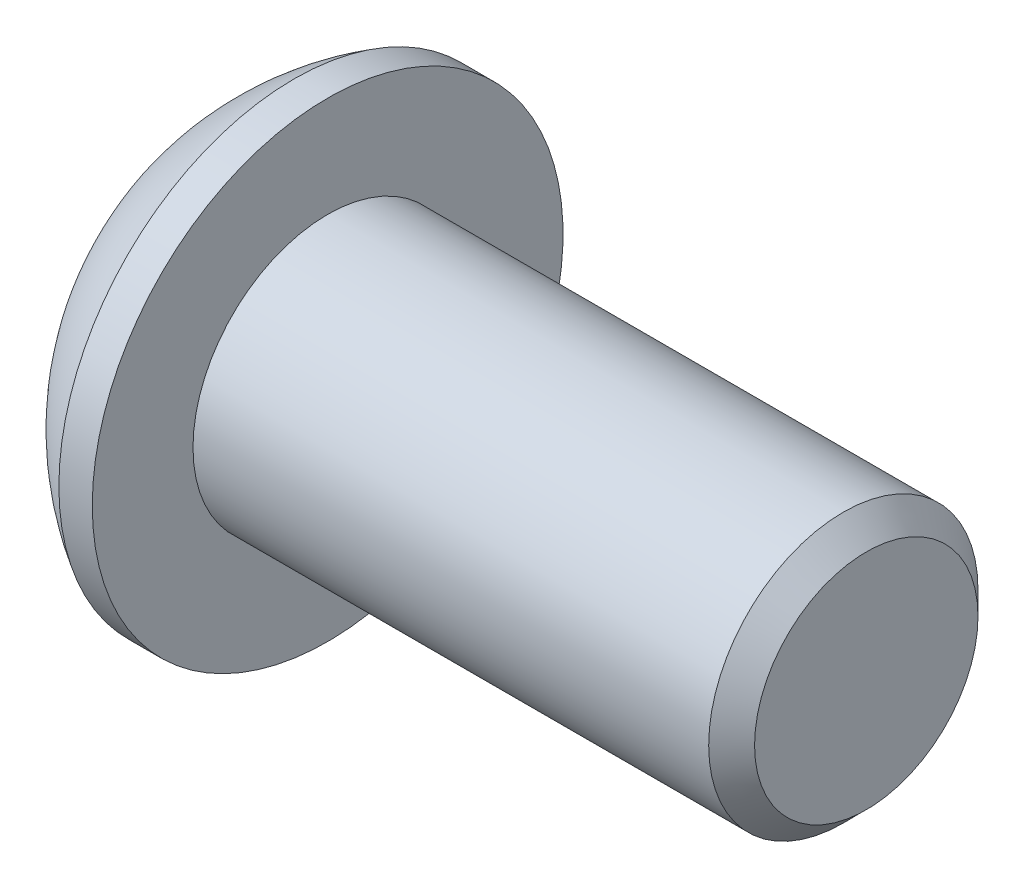
ISO-10303-21;
HEADER;
FILE_DESCRIPTION(('STEP AP214'),'2;1');
FILE_NAME('part.step','',(''),(''),'','','');
FILE_SCHEMA(('AUTOMOTIVE_DESIGN { 1 0 10303 214 1 1 1 1 }'));
ENDSEC;
DATA;
#1=APPLICATION_CONTEXT('core data for automotive mechanical design processes');
#2=APPLICATION_PROTOCOL_DEFINITION('international standard','automotive_design',2000,#1);
#3=PRODUCT_CONTEXT('',#1,'mechanical');
#4=PRODUCT('Part','Part','',(#3));
#5=PRODUCT_RELATED_PRODUCT_CATEGORY('part','',(#4));
#6=PRODUCT_DEFINITION_FORMATION('','',#4);
#7=PRODUCT_DEFINITION_CONTEXT('part definition',#1,'design');
#8=PRODUCT_DEFINITION('design','',#6,#7);
#9=PRODUCT_DEFINITION_SHAPE('','',#8);
#10=(LENGTH_UNIT() NAMED_UNIT(*) SI_UNIT(.MILLI.,.METRE.));
#11=(NAMED_UNIT(*) PLANE_ANGLE_UNIT() SI_UNIT($,.RADIAN.));
#12=(NAMED_UNIT(*) SI_UNIT($,.STERADIAN.) SOLID_ANGLE_UNIT());
#13=UNCERTAINTY_MEASURE_WITH_UNIT(LENGTH_MEASURE(1.E-05),#10,'distance_accuracy_value','');
#14=(GEOMETRIC_REPRESENTATION_CONTEXT(3) GLOBAL_UNCERTAINTY_ASSIGNED_CONTEXT((#13)) GLOBAL_UNIT_ASSIGNED_CONTEXT((#10,
#11,#12)) REPRESENTATION_CONTEXT('',''));
#15=CARTESIAN_POINT('',(0.,0.,0.));
#16=DIRECTION('',(0.,0.,1.));
#17=DIRECTION('',(1.,0.,0.));
#18=AXIS2_PLACEMENT_3D('',#15,#16,#17);
#19=CARTESIAN_POINT('',(0.,0.,0.));
#20=DIRECTION('',(-1.,0.,0.));
#21=DIRECTION('',(0.,0.,1.));
#22=AXIS2_PLACEMENT_3D('',#19,#20,#21);
#23=PLANE('',#22);
#24=CARTESIAN_POINT('',(0.,0.,0.));
#25=DIRECTION('',(-1.,0.,0.));
#26=DIRECTION('',(0.,0.,1.));
#27=AXIS2_PLACEMENT_3D('',#24,#25,#26);
#28=CIRCLE('',#27,2.77495);
#29=CARTESIAN_POINT('',(0.,2.77495,0.));
#30=VERTEX_POINT('',#29);
#31=EDGE_CURVE('E11',#30,#30,#28,.T.);
#32=ORIENTED_EDGE('',*,*,#31,.T.);
#33=EDGE_LOOP('',(#32));
#34=FACE_BOUND('',#33,.T.);
#35=DIRECTION('',(0.,-1.,0.));
#36=VECTOR('',#35,1.);
#37=CARTESIAN_POINT('',(0.,-1.14384635331849,1.9812));
#38=LINE('',#37,#36);
#39=CARTESIAN_POINT('',(0.,1.14384635331849,1.9812));
#40=VERTEX_POINT('',#39);
#41=CARTESIAN_POINT('',(0.,-1.14384635331849,1.9812));
#42=VERTEX_POINT('',#41);
#43=EDGE_CURVE('E46',#40,#42,#38,.T.);
#44=ORIENTED_EDGE('',*,*,#43,.T.);
#45=DIRECTION('',(0.,-0.5,-0.866025403784439));
#46=VECTOR('',#45,1.);
#47=CARTESIAN_POINT('',(0.,-2.28769270663697,0.));
#48=LINE('',#47,#46);
#49=CARTESIAN_POINT('',(0.,-2.28769270663697,0.));
#50=VERTEX_POINT('',#49);
#51=EDGE_CURVE('E362',#42,#50,#48,.T.);
#52=ORIENTED_EDGE('',*,*,#51,.T.);
#53=DIRECTION('',(0.,0.5,-0.866025403784439));
#54=VECTOR('',#53,1.);
#55=CARTESIAN_POINT('',(0.,-1.14384635331849,-1.9812));
#56=LINE('',#55,#54);
#57=CARTESIAN_POINT('',(0.,-1.14384635331849,-1.9812));
#58=VERTEX_POINT('',#57);
#59=EDGE_CURVE('E126',#50,#58,#56,.T.);
#60=ORIENTED_EDGE('',*,*,#59,.T.);
#61=DIRECTION('',(0.,1.,0.));
#62=VECTOR('',#61,1.);
#63=CARTESIAN_POINT('',(0.,1.14384635331849,-1.9812));
#64=LINE('',#63,#62);
#65=CARTESIAN_POINT('',(0.,1.14384635331849,-1.9812));
#66=VERTEX_POINT('',#65);
#67=EDGE_CURVE('E365',#58,#66,#64,.T.);
#68=ORIENTED_EDGE('',*,*,#67,.T.);
#69=DIRECTION('',(0.,0.5,0.866025403784439));
#70=VECTOR('',#69,1.);
#71=CARTESIAN_POINT('',(0.,2.28769270663697,0.));
#72=LINE('',#71,#70);
#73=CARTESIAN_POINT('',(0.,2.28769270663697,0.));
#74=VERTEX_POINT('',#73);
#75=EDGE_CURVE('E367',#66,#74,#72,.T.);
#76=ORIENTED_EDGE('',*,*,#75,.T.);
#77=DIRECTION('',(0.,-0.5,0.866025403784439));
#78=VECTOR('',#77,1.);
#79=CARTESIAN_POINT('',(0.,1.14384635331849,1.9812));
#80=LINE('',#79,#78);
#81=EDGE_CURVE('E369',#74,#40,#80,.T.);
#82=ORIENTED_EDGE('',*,*,#81,.T.);
#83=EDGE_LOOP('',(#44,#52,#60,#68,#76,#82));
#84=FACE_BOUND('',#83,.T.);
#85=ADVANCED_FACE('F32',(#34,#84),#23,.T.);
#86=CARTESIAN_POINT('',(5.78512506188119,0.,0.));
#87=DIRECTION('',(-1.,0.,0.));
#88=DIRECTION('',(0.,1.,0.));
#89=AXIS2_PLACEMENT_3D('',#86,#87,#88);
#90=SPHERICAL_SURFACE('',#89,6.41623094067739);
#91=CARTESIAN_POINT('',(2.5654,0.,0.));
#92=DIRECTION('',(-1.,0.,0.));
#93=DIRECTION('',(0.,0.,1.));
#94=AXIS2_PLACEMENT_3D('',#91,#92,#93);
#95=CIRCLE('',#94,5.5499);
#96=CARTESIAN_POINT('',(2.5654,5.5499,0.));
#97=VERTEX_POINT('',#96);
#98=EDGE_CURVE('E39',#97,#97,#95,.T.);
#99=CARTESIAN_POINT('',(2.5654,5.5499,0.));
#100=CARTESIAN_POINT('',(2.53083708566419,5.52984868712258,0.));
#101=CARTESIAN_POINT('',(2.49646152825914,5.50947442663449,0.));
#102=CARTESIAN_POINT('',(2.42809701945272,5.4680872977392,0.));
#103=CARTESIAN_POINT('',(2.39410806805135,5.447074429332,0.));
#104=CARTESIAN_POINT('',(2.32652866339446,5.40441737190071,0.));
#105=CARTESIAN_POINT('',(2.29293821013895,5.38277318287661,0.));
#106=CARTESIAN_POINT('',(2.22616751866502,5.33886105159856,0.));
#107=CARTESIAN_POINT('',(2.19298728044662,5.3165931093446,0.));
#108=CARTESIAN_POINT('',(2.12704860244366,5.27144124070729,0.));
#109=CARTESIAN_POINT('',(2.09429016265912,5.24855731432393,0.));
#110=CARTESIAN_POINT('',(2.02920651509859,5.20218146582175,0.));
#111=CARTESIAN_POINT('',(1.99688130732261,5.17868954370292,0.));
#112=CARTESIAN_POINT('',(1.93267540683267,5.13110590319174,0.));
#113=CARTESIAN_POINT('',(1.90079471411871,5.10701418479938,0.));
#114=CARTESIAN_POINT('',(1.83748897146475,5.05823936086598,0.));
#115=CARTESIAN_POINT('',(1.80606392152475,5.03355625532495,0.));
#116=CARTESIAN_POINT('',(1.74368043314138,4.98360727255644,0.));
#117=CARTESIAN_POINT('',(1.71272199469802,4.95834139532897,0.));
#118=CARTESIAN_POINT('',(1.65128253514951,4.90723568808467,0.));
#119=CARTESIAN_POINT('',(1.62080151404435,4.88139585806785,0.));
#120=CARTESIAN_POINT('',(1.56032752837792,4.82915126447052,0.));
#121=CARTESIAN_POINT('',(1.53033456381665,4.80274650089003,0.));
#122=CARTESIAN_POINT('',(1.4708471600897,4.74938125657909,0.));
#123=CARTESIAN_POINT('',(1.44135272092403,4.72242077584864,0.));
#124=CARTESIAN_POINT('',(1.38287266283316,4.66795350762059,0.));
#125=CARTESIAN_POINT('',(1.35388704390797,4.64044672012299,0.));
#126=CARTESIAN_POINT('',(1.29643474354244,4.58489643942841,0.));
#127=CARTESIAN_POINT('',(1.26796806210209,4.55685294623144,0.));
#128=CARTESIAN_POINT('',(1.21156357281885,4.50023904253955,0.));
#129=CARTESIAN_POINT('',(1.18362576497595,4.47166863204464,0.));
#130=CARTESIAN_POINT('',(1.12828877440023,4.41401086607543,0.));
#131=CARTESIAN_POINT('',(1.10088959166741,4.38492351060113,0.));
#132=CARTESIAN_POINT('',(1.04663941482087,4.32624200742801,0.));
#133=CARTESIAN_POINT('',(1.01978842070714,4.2966478597292,0.));
#134=CARTESIAN_POINT('',(0.966643993266069,4.2369631017545,0.));
#135=CARTESIAN_POINT('',(0.94035055993872,4.20687249147862,0.));
#136=CARTESIAN_POINT('',(0.888330431624668,4.14620531128432,0.));
#137=CARTESIAN_POINT('',(0.862603736637966,4.11562874136591,0.));
#138=CARTESIAN_POINT('',(0.811726064743087,4.05400031444217,0.));
#139=CARTESIAN_POINT('',(0.786575087834911,4.02294845743684,0.));
#140=CARTESIAN_POINT('',(0.736857630884291,3.96038029479081,0.));
#141=CARTESIAN_POINT('',(0.712291150841848,3.9288639891501,0.));
#142=CARTESIAN_POINT('',(0.6637512623949,3.8653779297977,0.));
#143=CARTESIAN_POINT('',(0.639777853990396,3.833408176086,0.));
#144=CARTESIAN_POINT('',(0.592432476584127,3.76902637942894,0.));
#145=CARTESIAN_POINT('',(0.569060507582362,3.73661433648358,0.));
#146=CARTESIAN_POINT('',(0.522926166816147,3.67135927457555,0.));
#147=CARTESIAN_POINT('',(0.500163795051696,3.63851625561289,0.));
#148=CARTESIAN_POINT('',(0.455256593824864,3.57241070531295,0.));
#149=CARTESIAN_POINT('',(0.433111764362482,3.53914817397566,0.));
#150=CARTESIAN_POINT('',(0.389447377232278,3.47221520900886,0.));
#151=CARTESIAN_POINT('',(0.367927819564456,3.43854477537934,0.));
#152=CARTESIAN_POINT('',(0.325521487354906,3.37080775824281,0.));
#153=CARTESIAN_POINT('',(0.304634712813178,3.3367411747358,0.));
#154=CARTESIAN_POINT('',(0.263501236996927,3.26822374869429,0.));
#155=CARTESIAN_POINT('',(0.243254535722403,3.23377290615979,0.));
#156=CARTESIAN_POINT('',(0.203408274368182,3.16449898643303,0.));
#157=CARTESIAN_POINT('',(0.183808714288484,3.12967590924077,0.));
#158=CARTESIAN_POINT('',(0.14526357289266,3.05966967674634,0.));
#159=CARTESIAN_POINT('',(0.126317991576534,3.02448652144419,0.));
#160=CARTESIAN_POINT('',(0.089087433723099,2.95377240655615,0.));
#161=CARTESIAN_POINT('',(0.0708024571857911,2.91824144697028,0.));
#162=CARTESIAN_POINT('',(0.0348994419493881,2.84684415010637,0.));
#163=CARTESIAN_POINT('',(0.017281403250293,2.81097781282834,0.));
#164=CARTESIAN_POINT('',(0.,2.77495,0.));
#165=B_SPLINE_CURVE_WITH_KNOTS('',3,(#99,#100,#101,#102,#103,#104,#105,#106,#107,#108,#109,#110,
#111,#112,#113,#114,#115,#116,#117,#118,#119,#120,#121,#122,#123,#124,#125,#126,#127,#128,#129,
#130,#131,#132,#133,#134,#135,#136,#137,#138,#139,#140,#141,#142,#143,#144,#145,#146,#147,#148,
#149,#150,#151,#152,#153,#154,#155,#156,#157,#158,#159,#160,#161,#162,#163,#164),.UNSPECIFIED.,
.F.,.F.,(4,2,2,2,2,2,2,2,2,2,2,2,2,2,2,2,2,2,2,2,2,2,2,2,2,2,2,2,2,2,2,2,4),(0.,
0.119872570538484,0.239745141076968,0.359617711615453,0.479490282153937,0.599362852692421,
0.719235423230905,0.83910799376939,0.958980564307873,1.07885313484636,1.19872570538484,
1.31859827592333,1.43847084646181,1.55834341700029,1.67821598753878,1.79808855807726,
1.91796112861575,2.03783369915423,2.15770626969271,2.2775788402312,2.39745141076968,
2.51732398130817,2.63719655184665,2.75706912238513,2.87694169292362,2.9968142634621,
3.11668683400059,3.23655940453907,3.35643197507756,3.47630454561604,3.59617711615452,
3.71604968669301,3.83592225723149),.UNSPECIFIED.);
#166=EDGE_CURVE('BSEAM153',#97,#30,#165,.T.);
#167=ORIENTED_EDGE('',*,*,#98,.T.);
#168=ORIENTED_EDGE('',*,*,#31,.F.);
#169=ORIENTED_EDGE('',*,*,#166,.T.);
#170=ORIENTED_EDGE('',*,*,#166,.F.);
#171=EDGE_LOOP('',(#167,#169,#168,#170));
#172=FACE_BOUND('',#171,.T.);
#173=ADVANCED_FACE('F153',(#172),#90,.T.);
#174=CARTESIAN_POINT('',(0.,0.,0.));
#175=DIRECTION('',(-1.,0.,0.));
#176=DIRECTION('',(0.,0.,1.));
#177=AXIS2_PLACEMENT_3D('',#174,#175,#176);
#178=CYLINDRICAL_SURFACE('',#177,5.5499);
#179=ORIENTED_EDGE('',*,*,#98,.F.);
#180=EDGE_LOOP('',(#179));
#181=FACE_BOUND('',#180,.T.);
#182=CARTESIAN_POINT('',(3.3528,0.,0.));
#183=DIRECTION('',(-1.,0.,0.));
#184=DIRECTION('',(0.,0.,1.));
#185=AXIS2_PLACEMENT_3D('',#182,#183,#184);
#186=CIRCLE('',#185,5.5499);
#187=CARTESIAN_POINT('',(3.3528,0.,5.5499));
#188=VERTEX_POINT('',#187);
#189=EDGE_CURVE('E148',#188,#188,#186,.T.);
#190=ORIENTED_EDGE('',*,*,#189,.T.);
#191=EDGE_LOOP('',(#190));
#192=FACE_BOUND('',#191,.T.);
#193=ADVANCED_FACE('F156',(#181,#192),#178,.T.);
#194=CARTESIAN_POINT('',(3.3528,3.17499999999999,0.));
#195=DIRECTION('',(-1.,0.,0.));
#196=DIRECTION('',(0.,0.,1.));
#197=AXIS2_PLACEMENT_3D('',#194,#195,#196);
#198=PLANE('',#197);
#199=ORIENTED_EDGE('',*,*,#189,.F.);
#200=EDGE_LOOP('',(#199));
#201=FACE_BOUND('',#200,.T.);
#202=CARTESIAN_POINT('',(3.3528,0.,0.));
#203=DIRECTION('',(-1.,0.,0.));
#204=DIRECTION('',(0.,0.,1.));
#205=AXIS2_PLACEMENT_3D('',#202,#203,#204);
#206=CIRCLE('',#205,3.17499999999999);
#207=CARTESIAN_POINT('',(3.3528,0.,3.17499999999999));
#208=VERTEX_POINT('',#207);
#209=EDGE_CURVE('E145',#208,#208,#206,.T.);
#210=ORIENTED_EDGE('',*,*,#209,.T.);
#211=EDGE_LOOP('',(#210));
#212=FACE_BOUND('',#211,.T.);
#213=ADVANCED_FACE('F159',(#201,#212),#198,.F.);
#214=CARTESIAN_POINT('',(0.,0.,0.));
#215=DIRECTION('',(-1.,0.,0.));
#216=DIRECTION('',(0.,0.,1.));
#217=AXIS2_PLACEMENT_3D('',#214,#215,#216);
#218=CYLINDRICAL_SURFACE('',#217,3.17499999999999);
#219=ORIENTED_EDGE('',*,*,#209,.F.);
#220=EDGE_LOOP('',(#219));
#221=FACE_BOUND('',#220,.T.);
#222=CARTESIAN_POINT('',(15.51178,0.,0.));
#223=DIRECTION('',(-1.,0.,0.));
#224=DIRECTION('',(0.,0.,1.));
#225=AXIS2_PLACEMENT_3D('',#222,#223,#224);
#226=CIRCLE('',#225,3.17499999999999);
#227=CARTESIAN_POINT('',(15.51178,0.,3.17499999999999));
#228=VERTEX_POINT('',#227);
#229=EDGE_CURVE('E142',#228,#228,#226,.T.);
#230=ORIENTED_EDGE('',*,*,#229,.T.);
#231=EDGE_LOOP('',(#230));
#232=FACE_BOUND('',#231,.T.);
#233=ADVANCED_FACE('F165',(#221,#232),#218,.T.);
#234=CARTESIAN_POINT('',(16.0528,0.,0.));
#235=DIRECTION('',(-1.,0.,0.));
#236=DIRECTION('',(0.,0.,1.));
#237=AXIS2_PLACEMENT_3D('',#234,#235,#236);
#238=CONICAL_SURFACE('',#237,2.63398,0.785398163397462);
#239=ORIENTED_EDGE('',*,*,#229,.F.);
#240=EDGE_LOOP('',(#239));
#241=FACE_BOUND('',#240,.T.);
#242=CARTESIAN_POINT('',(16.0528,0.,0.));
#243=DIRECTION('',(-1.,0.,0.));
#244=DIRECTION('',(0.,0.,1.));
#245=AXIS2_PLACEMENT_3D('',#242,#243,#244);
#246=CIRCLE('',#245,2.63398);
#247=CARTESIAN_POINT('',(16.0528,0.,2.63398));
#248=VERTEX_POINT('',#247);
#249=EDGE_CURVE('E138',#248,#248,#246,.T.);
#250=ORIENTED_EDGE('',*,*,#249,.T.);
#251=EDGE_LOOP('',(#250));
#252=FACE_BOUND('',#251,.T.);
#253=ADVANCED_FACE('F171',(#241,#252),#238,.T.);
#254=CARTESIAN_POINT('',(16.0528,0.,0.));
#255=DIRECTION('',(-1.,0.,0.));
#256=DIRECTION('',(0.,0.,1.));
#257=AXIS2_PLACEMENT_3D('',#254,#255,#256);
#258=PLANE('',#257);
#259=ORIENTED_EDGE('',*,*,#249,.F.);
#260=EDGE_LOOP('',(#259));
#261=FACE_BOUND('',#260,.T.);
#262=ADVANCED_FACE('F177',(#261),#258,.F.);
#263=CARTESIAN_POINT('',(2.2098,-2.28769270663697,0.));
#264=DIRECTION('',(0.,0.866025403784439,-0.5));
#265=DIRECTION('',(0.,0.5,0.866025403784439));
#266=AXIS2_PLACEMENT_3D('',#263,#264,#265);
#267=PLANE('',#266);
#268=DIRECTION('',(0.,-0.5,-0.866025403784439));
#269=VECTOR('',#268,1.);
#270=CARTESIAN_POINT('',(2.2098,-2.28769270663697,0.));
#271=LINE('',#270,#269);
#272=CARTESIAN_POINT('',(2.2098,-1.14384635331849,1.9812));
#273=VERTEX_POINT('',#272);
#274=CARTESIAN_POINT('',(2.2098,-1.71576952997773,0.9906));
#275=VERTEX_POINT('',#274);
#276=EDGE_CURVE('E112',#273,#275,#271,.T.);
#277=ORIENTED_EDGE('',*,*,#276,.T.);
#278=CARTESIAN_POINT('',(2.2098,-2.28769270663697,0.));
#279=VERTEX_POINT('',#278);
#280=EDGE_CURVE('E107',#275,#279,#271,.T.);
#281=ORIENTED_EDGE('',*,*,#280,.T.);
#282=DIRECTION('',(-1.,0.,0.));
#283=VECTOR('',#282,1.);
#284=CARTESIAN_POINT('',(2.2098,-2.28769270663697,0.));
#285=LINE('',#284,#283);
#286=EDGE_CURVE('E109',#279,#50,#285,.T.);
#287=ORIENTED_EDGE('',*,*,#286,.T.);
#288=ORIENTED_EDGE('',*,*,#51,.F.);
#289=DIRECTION('',(-1.,0.,0.));
#290=VECTOR('',#289,1.);
#291=CARTESIAN_POINT('',(2.2098,-1.14384635331849,1.9812));
#292=LINE('',#291,#290);
#293=EDGE_CURVE('E357',#273,#42,#292,.T.);
#294=ORIENTED_EDGE('',*,*,#293,.F.);
#295=EDGE_LOOP('',(#277,#281,#287,#288,#294));
#296=FACE_BOUND('',#295,.T.);
#297=ADVANCED_FACE('F108',(#296),#267,.T.);
#298=CARTESIAN_POINT('',(2.2098,-1.14384635331849,-1.9812));
#299=DIRECTION('',(0.,0.866025403784439,0.5));
#300=DIRECTION('',(0.,-0.5,0.866025403784439));
#301=AXIS2_PLACEMENT_3D('',#298,#299,#300);
#302=PLANE('',#301);
#303=DIRECTION('',(0.,0.5,-0.866025403784439));
#304=VECTOR('',#303,1.);
#305=CARTESIAN_POINT('',(2.2098,-1.14384635331849,-1.9812));
#306=LINE('',#305,#304);
#307=CARTESIAN_POINT('',(2.2098,-1.71576952997773,-0.9906));
#308=VERTEX_POINT('',#307);
#309=EDGE_CURVE('E54',#279,#308,#306,.T.);
#310=ORIENTED_EDGE('',*,*,#309,.T.);
#311=CARTESIAN_POINT('',(2.2098,-1.14384635331849,-1.9812));
#312=VERTEX_POINT('',#311);
#313=EDGE_CURVE('E121',#308,#312,#306,.T.);
#314=ORIENTED_EDGE('',*,*,#313,.T.);
#315=DIRECTION('',(-1.,0.,0.));
#316=VECTOR('',#315,1.);
#317=CARTESIAN_POINT('',(2.2098,-1.14384635331849,-1.9812));
#318=LINE('',#317,#316);
#319=EDGE_CURVE('E128',#312,#58,#318,.T.);
#320=ORIENTED_EDGE('',*,*,#319,.T.);
#321=ORIENTED_EDGE('',*,*,#59,.F.);
#322=ORIENTED_EDGE('',*,*,#286,.F.);
#323=EDGE_LOOP('',(#310,#314,#320,#321,#322));
#324=FACE_BOUND('',#323,.T.);
#325=ADVANCED_FACE('F124',(#324),#302,.T.);
#326=CARTESIAN_POINT('',(2.2098,1.14384635331849,-1.9812));
#327=DIRECTION('',(0.,0.,1.));
#328=DIRECTION('',(1.,0.,0.));
#329=AXIS2_PLACEMENT_3D('',#326,#327,#328);
#330=PLANE('',#329);
#331=DIRECTION('',(0.,1.,0.));
#332=VECTOR('',#331,1.);
#333=CARTESIAN_POINT('',(2.2098,1.14384635331849,-1.9812));
#334=LINE('',#333,#332);
#335=CARTESIAN_POINT('',(2.2098,0.,-1.9812));
#336=VERTEX_POINT('',#335);
#337=EDGE_CURVE('E387',#312,#336,#334,.T.);
#338=ORIENTED_EDGE('',*,*,#337,.T.);
#339=CARTESIAN_POINT('',(2.2098,1.14384635331849,-1.9812));
#340=VERTEX_POINT('',#339);
#341=EDGE_CURVE('E120',#336,#340,#334,.T.);
#342=ORIENTED_EDGE('',*,*,#341,.T.);
#343=DIRECTION('',(-1.,0.,0.));
#344=VECTOR('',#343,1.);
#345=CARTESIAN_POINT('',(2.2098,1.14384635331849,-1.9812));
#346=LINE('',#345,#344);
#347=EDGE_CURVE('E133',#340,#66,#346,.T.);
#348=ORIENTED_EDGE('',*,*,#347,.T.);
#349=ORIENTED_EDGE('',*,*,#67,.F.);
#350=ORIENTED_EDGE('',*,*,#319,.F.);
#351=EDGE_LOOP('',(#338,#342,#348,#349,#350));
#352=FACE_BOUND('',#351,.T.);
#353=ADVANCED_FACE('F236',(#352),#330,.T.);
#354=CARTESIAN_POINT('',(2.2098,2.28769270663697,0.));
#355=DIRECTION('',(0.,-0.866025403784439,0.5));
#356=DIRECTION('',(0.,-0.5,-0.866025403784439));
#357=AXIS2_PLACEMENT_3D('',#354,#355,#356);
#358=PLANE('',#357);
#359=DIRECTION('',(0.,0.5,0.866025403784439));
#360=VECTOR('',#359,1.);
#361=CARTESIAN_POINT('',(2.2098,2.28769270663697,0.));
#362=LINE('',#361,#360);
#363=CARTESIAN_POINT('',(2.2098,1.71576952997773,-0.990600000000001));
#364=VERTEX_POINT('',#363);
#365=EDGE_CURVE('E391',#340,#364,#362,.T.);
#366=ORIENTED_EDGE('',*,*,#365,.T.);
#367=CARTESIAN_POINT('',(2.2098,2.28769270663697,0.));
#368=VERTEX_POINT('',#367);
#369=EDGE_CURVE('E389',#364,#368,#362,.T.);
#370=ORIENTED_EDGE('',*,*,#369,.T.);
#371=DIRECTION('',(-1.,0.,0.));
#372=VECTOR('',#371,1.);
#373=CARTESIAN_POINT('',(2.2098,2.28769270663697,0.));
#374=LINE('',#373,#372);
#375=EDGE_CURVE('E373',#368,#74,#374,.T.);
#376=ORIENTED_EDGE('',*,*,#375,.T.);
#377=ORIENTED_EDGE('',*,*,#75,.F.);
#378=ORIENTED_EDGE('',*,*,#347,.F.);
#379=EDGE_LOOP('',(#366,#370,#376,#377,#378));
#380=FACE_BOUND('',#379,.T.);
#381=ADVANCED_FACE('F245',(#380),#358,.T.);
#382=CARTESIAN_POINT('',(2.2098,1.14384635331849,1.9812));
#383=DIRECTION('',(0.,-0.866025403784439,-0.5));
#384=DIRECTION('',(0.,0.5,-0.866025403784439));
#385=AXIS2_PLACEMENT_3D('',#382,#383,#384);
#386=PLANE('',#385);
#387=DIRECTION('',(0.,-0.5,0.866025403784439));
#388=VECTOR('',#387,1.);
#389=CARTESIAN_POINT('',(2.2098,1.14384635331849,1.9812));
#390=LINE('',#389,#388);
#391=CARTESIAN_POINT('',(2.2098,1.71576952997773,0.990600000000001));
#392=VERTEX_POINT('',#391);
#393=EDGE_CURVE('E352',#368,#392,#390,.T.);
#394=ORIENTED_EDGE('',*,*,#393,.T.);
#395=CARTESIAN_POINT('',(2.2098,1.14384635331849,1.9812));
#396=VERTEX_POINT('',#395);
#397=EDGE_CURVE('E348',#392,#396,#390,.T.);
#398=ORIENTED_EDGE('',*,*,#397,.T.);
#399=DIRECTION('',(-1.,0.,0.));
#400=VECTOR('',#399,1.);
#401=CARTESIAN_POINT('',(2.2098,1.14384635331849,1.9812));
#402=LINE('',#401,#400);
#403=EDGE_CURVE('E356',#396,#40,#402,.T.);
#404=ORIENTED_EDGE('',*,*,#403,.T.);
#405=ORIENTED_EDGE('',*,*,#81,.F.);
#406=ORIENTED_EDGE('',*,*,#375,.F.);
#407=EDGE_LOOP('',(#394,#398,#404,#405,#406));
#408=FACE_BOUND('',#407,.T.);
#409=ADVANCED_FACE('F255',(#408),#386,.T.);
#410=CARTESIAN_POINT('',(2.2098,-1.14384635331849,1.9812));
#411=DIRECTION('',(0.,0.,-1.));
#412=DIRECTION('',(0.,1.,0.));
#413=AXIS2_PLACEMENT_3D('',#410,#411,#412);
#414=PLANE('',#413);
#415=DIRECTION('',(0.,-1.,0.));
#416=VECTOR('',#415,1.);
#417=CARTESIAN_POINT('',(2.2098,-1.14384635331849,1.9812));
#418=LINE('',#417,#416);
#419=CARTESIAN_POINT('',(2.2098,0.,1.9812));
#420=VERTEX_POINT('',#419);
#421=EDGE_CURVE('E347',#396,#420,#418,.T.);
#422=ORIENTED_EDGE('',*,*,#421,.T.);
#423=EDGE_CURVE('E350',#420,#273,#418,.T.);
#424=ORIENTED_EDGE('',*,*,#423,.T.);
#425=ORIENTED_EDGE('',*,*,#293,.T.);
#426=ORIENTED_EDGE('',*,*,#43,.F.);
#427=ORIENTED_EDGE('',*,*,#403,.F.);
#428=EDGE_LOOP('',(#422,#424,#425,#426,#427));
#429=FACE_BOUND('',#428,.T.);
#430=ADVANCED_FACE('F265',(#429),#414,.T.);
#431=CARTESIAN_POINT('',(2.2098,-2.28769270663697,0.));
#432=DIRECTION('',(1.,0.,0.));
#433=DIRECTION('',(0.,0.,-1.));
#434=AXIS2_PLACEMENT_3D('',#431,#432,#433);
#435=PLANE('',#434);
#436=CARTESIAN_POINT('',(2.2098,0.,0.));
#437=DIRECTION('',(-1.,0.,0.));
#438=DIRECTION('',(0.,0.,1.));
#439=AXIS2_PLACEMENT_3D('',#436,#437,#438);
#440=CIRCLE('',#439,1.9812);
#441=EDGE_CURVE('E394',#364,#336,#440,.T.);
#442=ORIENTED_EDGE('',*,*,#441,.F.);
#443=ORIENTED_EDGE('',*,*,#365,.F.);
#444=ORIENTED_EDGE('',*,*,#341,.F.);
#445=EDGE_LOOP('',(#442,#443,#444));
#446=FACE_BOUND('',#445,.T.);
#447=ADVANCED_FACE('F275',(#446),#435,.F.);
#448=EDGE_CURVE('E139',#392,#364,#440,.T.);
#449=ORIENTED_EDGE('',*,*,#448,.F.);
#450=ORIENTED_EDGE('',*,*,#393,.F.);
#451=ORIENTED_EDGE('',*,*,#369,.F.);
#452=EDGE_LOOP('',(#449,#450,#451));
#453=FACE_BOUND('',#452,.T.);
#454=ADVANCED_FACE('F285',(#453),#435,.F.);
#455=EDGE_CURVE('E132',#420,#392,#440,.T.);
#456=ORIENTED_EDGE('',*,*,#455,.F.);
#457=ORIENTED_EDGE('',*,*,#421,.F.);
#458=ORIENTED_EDGE('',*,*,#397,.F.);
#459=EDGE_LOOP('',(#456,#457,#458));
#460=FACE_BOUND('',#459,.T.);
#461=ADVANCED_FACE('F296',(#460),#435,.F.);
#462=EDGE_CURVE('E127',#275,#420,#440,.T.);
#463=ORIENTED_EDGE('',*,*,#462,.F.);
#464=ORIENTED_EDGE('',*,*,#276,.F.);
#465=ORIENTED_EDGE('',*,*,#423,.F.);
#466=EDGE_LOOP('',(#463,#464,#465));
#467=FACE_BOUND('',#466,.T.);
#468=ADVANCED_FACE('F305',(#467),#435,.F.);
#469=EDGE_CURVE('E118',#308,#275,#440,.T.);
#470=ORIENTED_EDGE('',*,*,#469,.F.);
#471=ORIENTED_EDGE('',*,*,#309,.F.);
#472=ORIENTED_EDGE('',*,*,#280,.F.);
#473=EDGE_LOOP('',(#470,#471,#472));
#474=FACE_BOUND('',#473,.T.);
#475=ADVANCED_FACE('F117',(#474),#435,.F.);
#476=EDGE_CURVE('E388',#336,#308,#440,.T.);
#477=ORIENTED_EDGE('',*,*,#476,.F.);
#478=ORIENTED_EDGE('',*,*,#337,.F.);
#479=ORIENTED_EDGE('',*,*,#313,.F.);
#480=EDGE_LOOP('',(#477,#478,#479));
#481=FACE_BOUND('',#480,.T.);
#482=ADVANCED_FACE('F288',(#481),#435,.F.);
#483=CARTESIAN_POINT('',(3.3536463533185,0.,0.));
#484=DIRECTION('',(-1.,0.,0.));
#485=DIRECTION('',(0.,0.,1.));
#486=AXIS2_PLACEMENT_3D('',#483,#484,#485);
#487=CONICAL_SURFACE('',#486,0.,1.04719755119659);
#488=ORIENTED_EDGE('',*,*,#455,.T.);
#489=ORIENTED_EDGE('',*,*,#448,.T.);
#490=ORIENTED_EDGE('',*,*,#441,.T.);
#491=ORIENTED_EDGE('',*,*,#476,.T.);
#492=ORIENTED_EDGE('',*,*,#469,.T.);
#493=ORIENTED_EDGE('',*,*,#462,.T.);
#494=EDGE_LOOP('',(#488,#489,#490,#491,#492,#493));
#495=FACE_BOUND('',#494,.T.);
#496=CARTESIAN_POINT('',(3.3536463533185,0.,0.));
#497=VERTEX_POINT('',#496);
#498=VERTEX_LOOP('',#497);
#499=FACE_BOUND('',#498,.T.);
#500=ADVANCED_FACE('F329',(#495,#499),#487,.F.);
#501=CLOSED_SHELL('',(#85,#173,#193,#213,#233,#253,#262,#297,#325,#353,#381,#409,#430,#447,#454,
#461,#468,#475,#482,#500));
#502=MANIFOLD_SOLID_BREP('B2',#501);
#503=ADVANCED_BREP_SHAPE_REPRESENTATION('',(#18,#502),#14);
#504=SHAPE_DEFINITION_REPRESENTATION(#9,#503);
ENDSEC;
END-ISO-10303-21;
